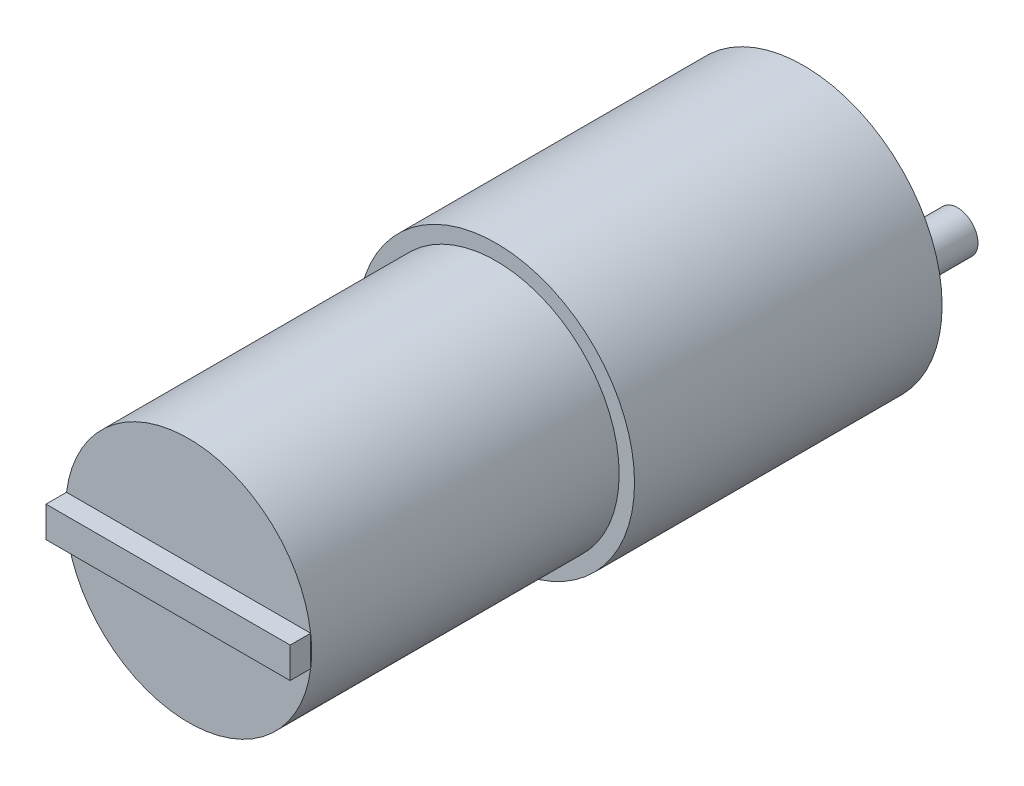
ISO-10303-21;
HEADER;
FILE_DESCRIPTION(('STEP AP214'),'2;1');
FILE_NAME('part.step','',(''),(''),'','','');
FILE_SCHEMA(('AUTOMOTIVE_DESIGN { 1 0 10303 214 1 1 1 1 }'));
ENDSEC;
DATA;
#1=APPLICATION_CONTEXT('core data for automotive mechanical design processes');
#2=APPLICATION_PROTOCOL_DEFINITION('international standard','automotive_design',2000,#1);
#3=PRODUCT_CONTEXT('',#1,'mechanical');
#4=PRODUCT('Part','Part','',(#3));
#5=PRODUCT_RELATED_PRODUCT_CATEGORY('part','',(#4));
#6=PRODUCT_DEFINITION_FORMATION('','',#4);
#7=PRODUCT_DEFINITION_CONTEXT('part definition',#1,'design');
#8=PRODUCT_DEFINITION('design','',#6,#7);
#9=PRODUCT_DEFINITION_SHAPE('','',#8);
#10=(LENGTH_UNIT() NAMED_UNIT(*) SI_UNIT(.MILLI.,.METRE.));
#11=(NAMED_UNIT(*) PLANE_ANGLE_UNIT() SI_UNIT($,.RADIAN.));
#12=(NAMED_UNIT(*) SI_UNIT($,.STERADIAN.) SOLID_ANGLE_UNIT());
#13=UNCERTAINTY_MEASURE_WITH_UNIT(LENGTH_MEASURE(1.E-05),#10,'distance_accuracy_value','');
#14=(GEOMETRIC_REPRESENTATION_CONTEXT(3) GLOBAL_UNCERTAINTY_ASSIGNED_CONTEXT((#13)) GLOBAL_UNIT_ASSIGNED_CONTEXT((#10,
#11,#12)) REPRESENTATION_CONTEXT('',''));
#15=CARTESIAN_POINT('',(0.,0.,0.));
#16=DIRECTION('',(0.,0.,1.));
#17=DIRECTION('',(1.,0.,0.));
#18=AXIS2_PLACEMENT_3D('',#15,#16,#17);
#19=CARTESIAN_POINT('',(0.,0.,60.));
#20=DIRECTION('',(0.,0.,1.));
#21=DIRECTION('',(1.,0.,0.));
#22=AXIS2_PLACEMENT_3D('',#19,#20,#21);
#23=PLANE('',#22);
#24=DIRECTION('',(0.,-1.,0.));
#25=VECTOR('',#24,1.);
#26=CARTESIAN_POINT('',(-11.9058808997907,1.5,60.));
#27=LINE('',#26,#25);
#28=CARTESIAN_POINT('',(-11.9058808997907,1.5,60.));
#29=VERTEX_POINT('',#28);
#30=CARTESIAN_POINT('',(-11.9058808997907,-1.5,60.));
#31=VERTEX_POINT('',#30);
#32=EDGE_CURVE('E58',#29,#31,#27,.T.);
#33=ORIENTED_EDGE('',*,*,#32,.F.);
#34=CARTESIAN_POINT('',(0.,0.,60.));
#35=DIRECTION('',(0.,0.,1.));
#36=DIRECTION('',(1.,0.,0.));
#37=AXIS2_PLACEMENT_3D('',#34,#35,#36);
#38=CIRCLE('',#37,12.);
#39=EDGE_CURVE('E123',#29,#31,#38,.T.);
#40=ORIENTED_EDGE('',*,*,#39,.T.);
#41=EDGE_LOOP('',(#33,#40));
#42=FACE_BOUND('',#41,.T.);
#43=ADVANCED_FACE('F37',(#42),#23,.T.);
#44=DIRECTION('',(-1.,0.,0.));
#45=VECTOR('',#44,1.);
#46=CARTESIAN_POINT('',(-11.9058808997907,1.5,60.));
#47=LINE('',#46,#45);
#48=CARTESIAN_POINT('',(11.9058808997907,1.50000000000001,60.));
#49=VERTEX_POINT('',#48);
#50=EDGE_CURVE('E98',#49,#29,#47,.T.);
#51=ORIENTED_EDGE('',*,*,#50,.F.);
#52=EDGE_CURVE('E120',#49,#29,#38,.T.);
#53=ORIENTED_EDGE('',*,*,#52,.T.);
#54=EDGE_LOOP('',(#51,#53));
#55=FACE_BOUND('',#54,.T.);
#56=ADVANCED_FACE('F146',(#55),#23,.T.);
#57=DIRECTION('',(0.,1.,0.));
#58=VECTOR('',#57,1.);
#59=CARTESIAN_POINT('',(11.9058808997907,1.5,60.));
#60=LINE('',#59,#58);
#61=CARTESIAN_POINT('',(11.9058808997907,-1.5,60.));
#62=VERTEX_POINT('',#61);
#63=EDGE_CURVE('E172',#62,#49,#60,.T.);
#64=ORIENTED_EDGE('',*,*,#63,.F.);
#65=EDGE_CURVE('E112',#62,#49,#38,.T.);
#66=ORIENTED_EDGE('',*,*,#65,.T.);
#67=EDGE_LOOP('',(#64,#66));
#68=FACE_BOUND('',#67,.T.);
#69=ADVANCED_FACE('F141',(#68),#23,.T.);
#70=CARTESIAN_POINT('',(0.,0.,60.));
#71=DIRECTION('',(0.,0.,-1.));
#72=DIRECTION('',(-1.,0.,0.));
#73=AXIS2_PLACEMENT_3D('',#70,#71,#72);
#74=CYLINDRICAL_SURFACE('',#73,13.5);
#75=CARTESIAN_POINT('',(0.,0.,0.));
#76=DIRECTION('',(0.,0.,1.));
#77=DIRECTION('',(1.,0.,0.));
#78=AXIS2_PLACEMENT_3D('',#75,#76,#77);
#79=CIRCLE('',#78,13.5);
#80=CARTESIAN_POINT('',(13.5,0.,0.));
#81=VERTEX_POINT('',#80);
#82=EDGE_CURVE('E115',#81,#81,#79,.T.);
#83=ORIENTED_EDGE('',*,*,#82,.T.);
#84=EDGE_LOOP('',(#83));
#85=FACE_BOUND('',#84,.T.);
#86=CARTESIAN_POINT('',(0.,0.,30.));
#87=DIRECTION('',(0.,0.,1.));
#88=DIRECTION('',(1.,0.,0.));
#89=AXIS2_PLACEMENT_3D('',#86,#87,#88);
#90=CIRCLE('',#89,13.5);
#91=CARTESIAN_POINT('',(13.5,0.,30.));
#92=VERTEX_POINT('',#91);
#93=EDGE_CURVE('E119',#92,#92,#90,.T.);
#94=ORIENTED_EDGE('',*,*,#93,.F.);
#95=EDGE_LOOP('',(#94));
#96=FACE_BOUND('',#95,.T.);
#97=ADVANCED_FACE('F39',(#85,#96),#74,.T.);
#98=CARTESIAN_POINT('',(0.,0.,0.));
#99=DIRECTION('',(0.,0.,1.));
#100=DIRECTION('',(1.,0.,0.));
#101=AXIS2_PLACEMENT_3D('',#98,#99,#100);
#102=PLANE('',#101);
#103=CARTESIAN_POINT('',(8.,0.,0.));
#104=DIRECTION('',(0.,0.,1.));
#105=DIRECTION('',(1.,0.,0.));
#106=AXIS2_PLACEMENT_3D('',#103,#104,#105);
#107=CIRCLE('',#106,2.);
#108=CARTESIAN_POINT('',(10.,0.,0.));
#109=VERTEX_POINT('',#108);
#110=EDGE_CURVE('E11',#109,#109,#107,.F.);
#111=ORIENTED_EDGE('',*,*,#110,.F.);
#112=EDGE_LOOP('',(#111));
#113=FACE_BOUND('',#112,.T.);
#114=CARTESIAN_POINT('',(0.,0.,0.));
#115=DIRECTION('',(0.,0.,-1.));
#116=DIRECTION('',(-1.,0.,0.));
#117=AXIS2_PLACEMENT_3D('',#114,#115,#116);
#118=CIRCLE('',#117,2.);
#119=CARTESIAN_POINT('',(-2.,0.,0.));
#120=VERTEX_POINT('',#119);
#121=EDGE_CURVE('E45',#120,#120,#118,.T.);
#122=ORIENTED_EDGE('',*,*,#121,.F.);
#123=EDGE_LOOP('',(#122));
#124=FACE_BOUND('',#123,.T.);
#125=ORIENTED_EDGE('',*,*,#82,.F.);
#126=EDGE_LOOP('',(#125));
#127=FACE_BOUND('',#126,.T.);
#128=ADVANCED_FACE('F130',(#113,#124,#127),#102,.F.);
#129=CARTESIAN_POINT('',(0.,0.,30.));
#130=DIRECTION('',(0.,0.,1.));
#131=DIRECTION('',(1.,0.,0.));
#132=AXIS2_PLACEMENT_3D('',#129,#130,#131);
#133=PLANE('',#132);
#134=CARTESIAN_POINT('',(0.,0.,30.));
#135=DIRECTION('',(0.,0.,1.));
#136=DIRECTION('',(1.,0.,0.));
#137=AXIS2_PLACEMENT_3D('',#134,#135,#136);
#138=CIRCLE('',#137,12.);
#139=CARTESIAN_POINT('',(12.,0.,30.));
#140=VERTEX_POINT('',#139);
#141=EDGE_CURVE('E116',#140,#140,#138,.T.);
#142=ORIENTED_EDGE('',*,*,#141,.F.);
#143=EDGE_LOOP('',(#142));
#144=FACE_BOUND('',#143,.T.);
#145=ORIENTED_EDGE('',*,*,#93,.T.);
#146=EDGE_LOOP('',(#145));
#147=FACE_BOUND('',#146,.T.);
#148=ADVANCED_FACE('F132',(#144,#147),#133,.T.);
#149=CARTESIAN_POINT('',(0.,0.,30.));
#150=DIRECTION('',(0.,0.,1.));
#151=DIRECTION('',(1.,0.,0.));
#152=AXIS2_PLACEMENT_3D('',#149,#150,#151);
#153=CYLINDRICAL_SURFACE('',#152,12.);
#154=ORIENTED_EDGE('',*,*,#141,.T.);
#155=EDGE_LOOP('',(#154));
#156=FACE_BOUND('',#155,.T.);
#157=ORIENTED_EDGE('',*,*,#52,.F.);
#158=ORIENTED_EDGE('',*,*,#65,.F.);
#159=EDGE_CURVE('E191',#31,#62,#38,.T.);
#160=ORIENTED_EDGE('',*,*,#159,.F.);
#161=ORIENTED_EDGE('',*,*,#39,.F.);
#162=EDGE_LOOP('',(#157,#158,#160,#161));
#163=FACE_BOUND('',#162,.T.);
#164=ADVANCED_FACE('F138',(#156,#163),#153,.T.);
#165=DIRECTION('',(1.,0.,0.));
#166=VECTOR('',#165,1.);
#167=CARTESIAN_POINT('',(-11.9058808997907,-1.5,60.));
#168=LINE('',#167,#166);
#169=EDGE_CURVE('E51',#31,#62,#168,.T.);
#170=ORIENTED_EDGE('',*,*,#169,.F.);
#171=ORIENTED_EDGE('',*,*,#159,.T.);
#172=EDGE_LOOP('',(#170,#171));
#173=FACE_BOUND('',#172,.T.);
#174=ADVANCED_FACE('F147',(#173),#23,.T.);
#175=CARTESIAN_POINT('',(0.,0.,-7.));
#176=DIRECTION('',(0.,0.,1.));
#177=DIRECTION('',(1.,0.,0.));
#178=AXIS2_PLACEMENT_3D('',#175,#176,#177);
#179=CYLINDRICAL_SURFACE('',#178,2.);
#180=CARTESIAN_POINT('',(0.,0.,-7.));
#181=DIRECTION('',(0.,0.,-1.));
#182=DIRECTION('',(-1.,0.,0.));
#183=AXIS2_PLACEMENT_3D('',#180,#181,#182);
#184=CIRCLE('',#183,2.);
#185=CARTESIAN_POINT('',(-2.,0.,-7.));
#186=VERTEX_POINT('',#185);
#187=EDGE_CURVE('E104',#186,#186,#184,.T.);
#188=ORIENTED_EDGE('',*,*,#187,.F.);
#189=EDGE_LOOP('',(#188));
#190=FACE_BOUND('',#189,.T.);
#191=ORIENTED_EDGE('',*,*,#121,.T.);
#192=EDGE_LOOP('',(#191));
#193=FACE_BOUND('',#192,.T.);
#194=ADVANCED_FACE('F154',(#190,#193),#179,.T.);
#195=CARTESIAN_POINT('',(0.,0.,-7.));
#196=DIRECTION('',(0.,0.,-1.));
#197=DIRECTION('',(-1.,0.,0.));
#198=AXIS2_PLACEMENT_3D('',#195,#196,#197);
#199=PLANE('',#198);
#200=ORIENTED_EDGE('',*,*,#187,.T.);
#201=EDGE_LOOP('',(#200));
#202=FACE_BOUND('',#201,.T.);
#203=ADVANCED_FACE('F160',(#202),#199,.T.);
#204=CARTESIAN_POINT('',(8.,0.,-7.));
#205=DIRECTION('',(0.,0.,1.));
#206=DIRECTION('',(1.,0.,0.));
#207=AXIS2_PLACEMENT_3D('',#204,#205,#206);
#208=CYLINDRICAL_SURFACE('',#207,2.);
#209=CARTESIAN_POINT('',(8.,0.,-7.));
#210=DIRECTION('',(0.,0.,-1.));
#211=DIRECTION('',(-1.,0.,0.));
#212=AXIS2_PLACEMENT_3D('',#209,#210,#211);
#213=CIRCLE('',#212,2.);
#214=CARTESIAN_POINT('',(6.,0.,-7.));
#215=VERTEX_POINT('',#214);
#216=EDGE_CURVE('E101',#215,#215,#213,.T.);
#217=ORIENTED_EDGE('',*,*,#216,.F.);
#218=EDGE_LOOP('',(#217));
#219=FACE_BOUND('',#218,.T.);
#220=ORIENTED_EDGE('',*,*,#110,.T.);
#221=EDGE_LOOP('',(#220));
#222=FACE_BOUND('',#221,.T.);
#223=ADVANCED_FACE('F206',(#219,#222),#208,.T.);
#224=CARTESIAN_POINT('',(8.,0.,-7.));
#225=DIRECTION('',(0.,0.,-1.));
#226=DIRECTION('',(-1.,0.,0.));
#227=AXIS2_PLACEMENT_3D('',#224,#225,#226);
#228=PLANE('',#227);
#229=ORIENTED_EDGE('',*,*,#216,.T.);
#230=EDGE_LOOP('',(#229));
#231=FACE_BOUND('',#230,.T.);
#232=ADVANCED_FACE('F205',(#231),#228,.T.);
#233=CARTESIAN_POINT('',(-11.9058808997907,1.5,62.));
#234=DIRECTION('',(1.,0.,0.));
#235=DIRECTION('',(0.,0.,-1.));
#236=AXIS2_PLACEMENT_3D('',#233,#234,#235);
#237=PLANE('',#236);
#238=ORIENTED_EDGE('',*,*,#32,.T.);
#239=DIRECTION('',(0.,0.,-1.));
#240=VECTOR('',#239,1.);
#241=CARTESIAN_POINT('',(-11.9058808997907,-1.5,62.));
#242=LINE('',#241,#240);
#243=CARTESIAN_POINT('',(-11.9058808997907,-1.5,62.));
#244=VERTEX_POINT('',#243);
#245=EDGE_CURVE('E83',#244,#31,#242,.T.);
#246=ORIENTED_EDGE('',*,*,#245,.F.);
#247=DIRECTION('',(0.,-1.,0.));
#248=VECTOR('',#247,1.);
#249=CARTESIAN_POINT('',(-11.9058808997907,1.5,62.));
#250=LINE('',#249,#248);
#251=CARTESIAN_POINT('',(-11.9058808997907,1.5,62.));
#252=VERTEX_POINT('',#251);
#253=EDGE_CURVE('E89',#252,#244,#250,.T.);
#254=ORIENTED_EDGE('',*,*,#253,.F.);
#255=DIRECTION('',(0.,0.,-1.));
#256=VECTOR('',#255,1.);
#257=CARTESIAN_POINT('',(-11.9058808997907,1.5,62.));
#258=LINE('',#257,#256);
#259=EDGE_CURVE('E182',#252,#29,#258,.T.);
#260=ORIENTED_EDGE('',*,*,#259,.T.);
#261=EDGE_LOOP('',(#238,#246,#254,#260));
#262=FACE_BOUND('',#261,.T.);
#263=ADVANCED_FACE('F100',(#262),#237,.F.);
#264=CARTESIAN_POINT('',(-11.9058808997907,-1.5,62.));
#265=DIRECTION('',(0.,1.,0.));
#266=DIRECTION('',(-1.,0.,0.));
#267=AXIS2_PLACEMENT_3D('',#264,#265,#266);
#268=PLANE('',#267);
#269=ORIENTED_EDGE('',*,*,#169,.T.);
#270=DIRECTION('',(0.,0.,-1.));
#271=VECTOR('',#270,1.);
#272=CARTESIAN_POINT('',(11.9058808997907,-1.5,62.));
#273=LINE('',#272,#271);
#274=CARTESIAN_POINT('',(11.9058808997907,-1.5,62.));
#275=VERTEX_POINT('',#274);
#276=EDGE_CURVE('E85',#275,#62,#273,.T.);
#277=ORIENTED_EDGE('',*,*,#276,.F.);
#278=DIRECTION('',(1.,0.,0.));
#279=VECTOR('',#278,1.);
#280=CARTESIAN_POINT('',(-11.9058808997907,-1.5,62.));
#281=LINE('',#280,#279);
#282=EDGE_CURVE('E79',#244,#275,#281,.T.);
#283=ORIENTED_EDGE('',*,*,#282,.F.);
#284=ORIENTED_EDGE('',*,*,#245,.T.);
#285=EDGE_LOOP('',(#269,#277,#283,#284));
#286=FACE_BOUND('',#285,.T.);
#287=ADVANCED_FACE('F81',(#286),#268,.F.);
#288=CARTESIAN_POINT('',(11.9058808997907,1.5,62.));
#289=DIRECTION('',(-1.,0.,0.));
#290=DIRECTION('',(0.,0.,1.));
#291=AXIS2_PLACEMENT_3D('',#288,#289,#290);
#292=PLANE('',#291);
#293=ORIENTED_EDGE('',*,*,#63,.T.);
#294=DIRECTION('',(0.,0.,-1.));
#295=VECTOR('',#294,1.);
#296=CARTESIAN_POINT('',(11.9058808997907,1.5,62.));
#297=LINE('',#296,#295);
#298=CARTESIAN_POINT('',(11.9058808997907,1.5,62.));
#299=VERTEX_POINT('',#298);
#300=EDGE_CURVE('E106',#299,#49,#297,.T.);
#301=ORIENTED_EDGE('',*,*,#300,.F.);
#302=DIRECTION('',(0.,1.,0.));
#303=VECTOR('',#302,1.);
#304=CARTESIAN_POINT('',(11.9058808997907,1.5,62.));
#305=LINE('',#304,#303);
#306=EDGE_CURVE('E88',#275,#299,#305,.T.);
#307=ORIENTED_EDGE('',*,*,#306,.F.);
#308=ORIENTED_EDGE('',*,*,#276,.T.);
#309=EDGE_LOOP('',(#293,#301,#307,#308));
#310=FACE_BOUND('',#309,.T.);
#311=ADVANCED_FACE('F180',(#310),#292,.F.);
#312=CARTESIAN_POINT('',(-11.9058808997907,1.5,62.));
#313=DIRECTION('',(0.,-1.,0.));
#314=DIRECTION('',(1.,0.,0.));
#315=AXIS2_PLACEMENT_3D('',#312,#313,#314);
#316=PLANE('',#315);
#317=ORIENTED_EDGE('',*,*,#50,.T.);
#318=ORIENTED_EDGE('',*,*,#259,.F.);
#319=DIRECTION('',(-1.,0.,0.));
#320=VECTOR('',#319,1.);
#321=CARTESIAN_POINT('',(-11.9058808997907,1.5,62.));
#322=LINE('',#321,#320);
#323=EDGE_CURVE('E94',#299,#252,#322,.T.);
#324=ORIENTED_EDGE('',*,*,#323,.F.);
#325=ORIENTED_EDGE('',*,*,#300,.T.);
#326=EDGE_LOOP('',(#317,#318,#324,#325));
#327=FACE_BOUND('',#326,.T.);
#328=ADVANCED_FACE('F189',(#327),#316,.F.);
#329=CARTESIAN_POINT('',(0.,0.,62.));
#330=DIRECTION('',(0.,0.,1.));
#331=DIRECTION('',(1.,0.,0.));
#332=AXIS2_PLACEMENT_3D('',#329,#330,#331);
#333=PLANE('',#332);
#334=ORIENTED_EDGE('',*,*,#253,.T.);
#335=ORIENTED_EDGE('',*,*,#282,.T.);
#336=ORIENTED_EDGE('',*,*,#306,.T.);
#337=ORIENTED_EDGE('',*,*,#323,.T.);
#338=EDGE_LOOP('',(#334,#335,#336,#337));
#339=FACE_BOUND('',#338,.T.);
#340=ADVANCED_FACE('F92',(#339),#333,.T.);
#341=CLOSED_SHELL('',(#43,#56,#69,#97,#128,#148,#164,#174,#194,#203,#223,#232,#263,#287,#311,
#328,#340));
#342=MANIFOLD_SOLID_BREP('B2',#341);
#343=ADVANCED_BREP_SHAPE_REPRESENTATION('',(#18,#342),#14);
#344=SHAPE_DEFINITION_REPRESENTATION(#9,#343);
ENDSEC;
END-ISO-10303-21;
